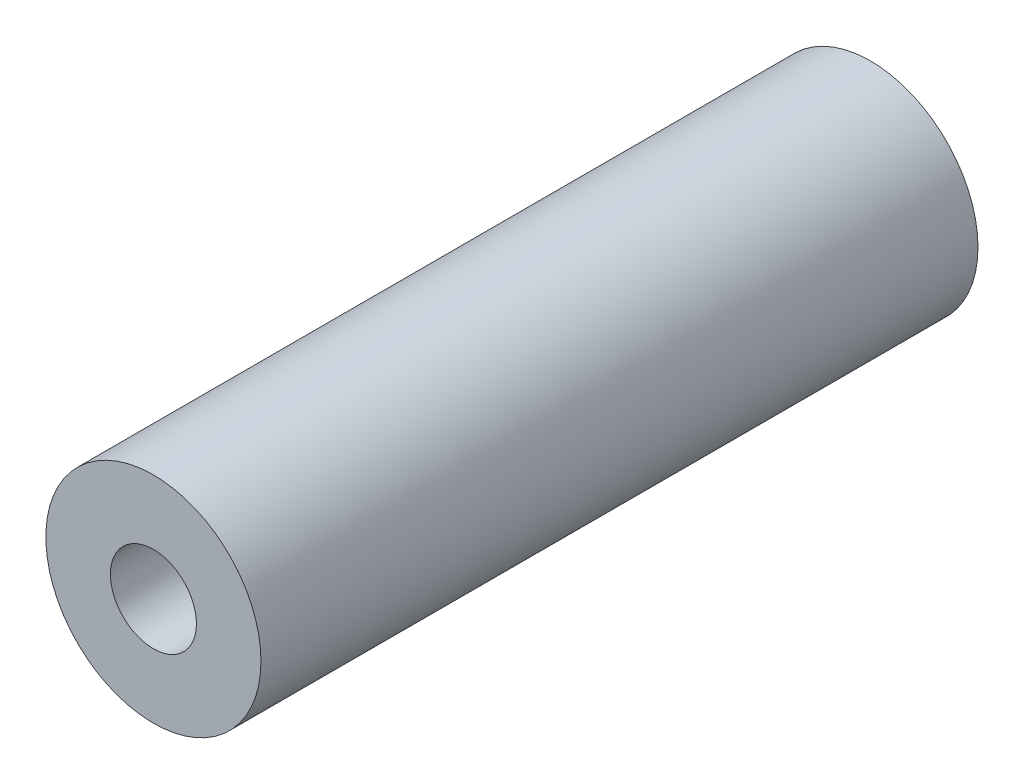
ISO-10303-21;
HEADER;
FILE_DESCRIPTION(('STEP AP214'),'2;1');
FILE_NAME('part.step','',(''),(''),'','','');
FILE_SCHEMA(('AUTOMOTIVE_DESIGN { 1 0 10303 214 1 1 1 1 }'));
ENDSEC;
DATA;
#1=APPLICATION_CONTEXT('core data for automotive mechanical design processes');
#2=APPLICATION_PROTOCOL_DEFINITION('international standard','automotive_design',2000,#1);
#3=PRODUCT_CONTEXT('',#1,'mechanical');
#4=PRODUCT('Part','Part','',(#3));
#5=PRODUCT_RELATED_PRODUCT_CATEGORY('part','',(#4));
#6=PRODUCT_DEFINITION_FORMATION('','',#4);
#7=PRODUCT_DEFINITION_CONTEXT('part definition',#1,'design');
#8=PRODUCT_DEFINITION('design','',#6,#7);
#9=PRODUCT_DEFINITION_SHAPE('','',#8);
#10=(LENGTH_UNIT() NAMED_UNIT(*) SI_UNIT(.MILLI.,.METRE.));
#11=(NAMED_UNIT(*) PLANE_ANGLE_UNIT() SI_UNIT($,.RADIAN.));
#12=(NAMED_UNIT(*) SI_UNIT($,.STERADIAN.) SOLID_ANGLE_UNIT());
#13=UNCERTAINTY_MEASURE_WITH_UNIT(LENGTH_MEASURE(1.E-05),#10,'distance_accuracy_value','');
#14=(GEOMETRIC_REPRESENTATION_CONTEXT(3) GLOBAL_UNCERTAINTY_ASSIGNED_CONTEXT((#13)) GLOBAL_UNIT_ASSIGNED_CONTEXT((#10,
#11,#12)) REPRESENTATION_CONTEXT('',''));
#15=CARTESIAN_POINT('',(0.,0.,0.));
#16=DIRECTION('',(0.,0.,1.));
#17=DIRECTION('',(1.,0.,0.));
#18=AXIS2_PLACEMENT_3D('',#15,#16,#17);
#19=CARTESIAN_POINT('',(0.,0.,15.));
#20=DIRECTION('',(0.,0.,-1.));
#21=DIRECTION('',(-1.,0.,0.));
#22=AXIS2_PLACEMENT_3D('',#19,#20,#21);
#23=CYLINDRICAL_SURFACE('',#22,0.99);
#24=CARTESIAN_POINT('',(0.,0.,0.));
#25=DIRECTION('',(0.,0.,1.));
#26=DIRECTION('',(1.,0.,0.));
#27=AXIS2_PLACEMENT_3D('',#24,#25,#26);
#28=CIRCLE('',#27,0.99);
#29=CARTESIAN_POINT('',(0.99,0.,0.));
#30=VERTEX_POINT('',#29);
#31=EDGE_CURVE('E52',#30,#30,#28,.T.);
#32=ORIENTED_EDGE('',*,*,#31,.F.);
#33=EDGE_LOOP('',(#32));
#34=FACE_BOUND('',#33,.T.);
#35=CARTESIAN_POINT('',(0.,0.,10.));
#36=DIRECTION('',(0.,0.,1.));
#37=DIRECTION('',(1.,0.,0.));
#38=AXIS2_PLACEMENT_3D('',#35,#36,#37);
#39=CIRCLE('',#38,0.99);
#40=CARTESIAN_POINT('',(0.99,0.,10.));
#41=VERTEX_POINT('',#40);
#42=EDGE_CURVE('E41',#41,#41,#39,.T.);
#43=ORIENTED_EDGE('',*,*,#42,.T.);
#44=EDGE_LOOP('',(#43));
#45=FACE_BOUND('',#44,.T.);
#46=ADVANCED_FACE('F37',(#34,#45),#23,.F.);
#47=CARTESIAN_POINT('',(0.,0.,15.));
#48=DIRECTION('',(0.,0.,1.));
#49=DIRECTION('',(1.,0.,0.));
#50=AXIS2_PLACEMENT_3D('',#47,#48,#49);
#51=PLANE('',#50);
#52=CARTESIAN_POINT('',(0.,0.,15.));
#53=DIRECTION('',(0.,0.,1.));
#54=DIRECTION('',(1.,0.,0.));
#55=AXIS2_PLACEMENT_3D('',#52,#53,#54);
#56=CIRCLE('',#55,2.25);
#57=CARTESIAN_POINT('',(2.25,0.,15.));
#58=VERTEX_POINT('',#57);
#59=EDGE_CURVE('E10',#58,#58,#56,.T.);
#60=ORIENTED_EDGE('',*,*,#59,.T.);
#61=EDGE_LOOP('',(#60));
#62=FACE_BOUND('',#61,.T.);
#63=CARTESIAN_POINT('',(0.,0.,15.));
#64=DIRECTION('',(0.,0.,1.));
#65=DIRECTION('',(1.,0.,0.));
#66=AXIS2_PLACEMENT_3D('',#63,#64,#65);
#67=CIRCLE('',#66,0.9);
#68=CARTESIAN_POINT('',(0.9,0.,15.));
#69=VERTEX_POINT('',#68);
#70=EDGE_CURVE('E57',#69,#69,#67,.T.);
#71=ORIENTED_EDGE('',*,*,#70,.F.);
#72=EDGE_LOOP('',(#71));
#73=FACE_BOUND('',#72,.T.);
#74=ADVANCED_FACE('F85',(#62,#73),#51,.T.);
#75=CARTESIAN_POINT('',(0.,0.,0.));
#76=DIRECTION('',(0.,0.,1.));
#77=DIRECTION('',(1.,0.,0.));
#78=AXIS2_PLACEMENT_3D('',#75,#76,#77);
#79=PLANE('',#78);
#80=CARTESIAN_POINT('',(0.,0.,0.));
#81=DIRECTION('',(0.,0.,1.));
#82=DIRECTION('',(1.,0.,0.));
#83=AXIS2_PLACEMENT_3D('',#80,#81,#82);
#84=CIRCLE('',#83,2.25);
#85=CARTESIAN_POINT('',(2.25,0.,0.));
#86=VERTEX_POINT('',#85);
#87=EDGE_CURVE('E46',#86,#86,#84,.T.);
#88=ORIENTED_EDGE('',*,*,#87,.F.);
#89=EDGE_LOOP('',(#88));
#90=FACE_BOUND('',#89,.T.);
#91=ORIENTED_EDGE('',*,*,#31,.T.);
#92=EDGE_LOOP('',(#91));
#93=FACE_BOUND('',#92,.T.);
#94=ADVANCED_FACE('F81',(#90,#93),#79,.F.);
#95=CARTESIAN_POINT('',(0.,0.,15.));
#96=DIRECTION('',(0.,0.,-1.));
#97=DIRECTION('',(-1.,0.,0.));
#98=AXIS2_PLACEMENT_3D('',#95,#96,#97);
#99=CYLINDRICAL_SURFACE('',#98,2.25);
#100=ORIENTED_EDGE('',*,*,#59,.F.);
#101=EDGE_LOOP('',(#100));
#102=FACE_BOUND('',#101,.T.);
#103=ORIENTED_EDGE('',*,*,#87,.T.);
#104=EDGE_LOOP('',(#103));
#105=FACE_BOUND('',#104,.T.);
#106=ADVANCED_FACE('F39',(#102,#105),#99,.T.);
#107=CARTESIAN_POINT('',(0.,0.,10.));
#108=DIRECTION('',(0.,0.,1.));
#109=DIRECTION('',(1.,0.,0.));
#110=AXIS2_PLACEMENT_3D('',#107,#108,#109);
#111=PLANE('',#110);
#112=CARTESIAN_POINT('',(0.,0.,10.));
#113=DIRECTION('',(0.,0.,1.));
#114=DIRECTION('',(1.,0.,0.));
#115=AXIS2_PLACEMENT_3D('',#112,#113,#114);
#116=CIRCLE('',#115,0.9);
#117=CARTESIAN_POINT('',(0.9,0.,10.));
#118=VERTEX_POINT('',#117);
#119=EDGE_CURVE('E61',#118,#118,#116,.T.);
#120=ORIENTED_EDGE('',*,*,#119,.T.);
#121=EDGE_LOOP('',(#120));
#122=FACE_BOUND('',#121,.T.);
#123=ORIENTED_EDGE('',*,*,#42,.F.);
#124=EDGE_LOOP('',(#123));
#125=FACE_BOUND('',#124,.T.);
#126=ADVANCED_FACE('F71',(#122,#125),#111,.F.);
#127=CARTESIAN_POINT('',(0.,0.,10.));
#128=DIRECTION('',(0.,0.,1.));
#129=DIRECTION('',(1.,0.,0.));
#130=AXIS2_PLACEMENT_3D('',#127,#128,#129);
#131=CYLINDRICAL_SURFACE('',#130,0.9);
#132=ORIENTED_EDGE('',*,*,#119,.F.);
#133=EDGE_LOOP('',(#132));
#134=FACE_BOUND('',#133,.T.);
#135=ORIENTED_EDGE('',*,*,#70,.T.);
#136=EDGE_LOOP('',(#135));
#137=FACE_BOUND('',#136,.T.);
#138=ADVANCED_FACE('F73',(#134,#137),#131,.F.);
#139=CLOSED_SHELL('',(#46,#74,#94,#106,#126,#138));
#140=MANIFOLD_SOLID_BREP('B2',#139);
#141=ADVANCED_BREP_SHAPE_REPRESENTATION('',(#18,#140),#14);
#142=SHAPE_DEFINITION_REPRESENTATION(#9,#141);
ENDSEC;
END-ISO-10303-21;
